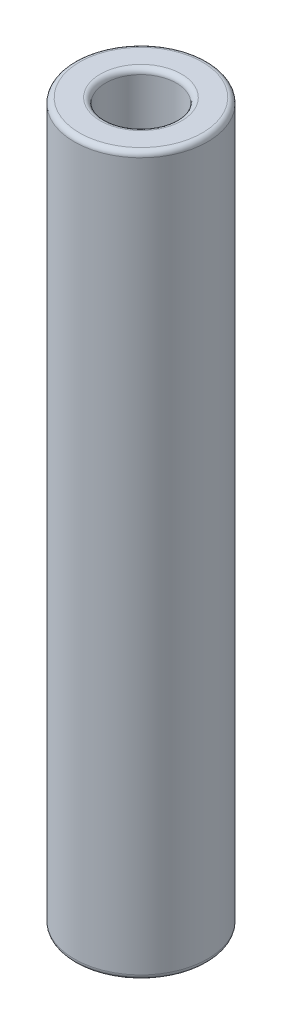
ISO-10303-21;
HEADER;
FILE_DESCRIPTION(('STEP AP214'),'2;1');
FILE_NAME('part.step','',(''),(''),'','','');
FILE_SCHEMA(('AUTOMOTIVE_DESIGN { 1 0 10303 214 1 1 1 1 }'));
ENDSEC;
DATA;
#1=APPLICATION_CONTEXT('core data for automotive mechanical design processes');
#2=APPLICATION_PROTOCOL_DEFINITION('international standard','automotive_design',2000,#1);
#3=PRODUCT_CONTEXT('',#1,'mechanical');
#4=PRODUCT('Part','Part','',(#3));
#5=PRODUCT_RELATED_PRODUCT_CATEGORY('part','',(#4));
#6=PRODUCT_DEFINITION_FORMATION('','',#4);
#7=PRODUCT_DEFINITION_CONTEXT('part definition',#1,'design');
#8=PRODUCT_DEFINITION('design','',#6,#7);
#9=PRODUCT_DEFINITION_SHAPE('','',#8);
#10=(LENGTH_UNIT() NAMED_UNIT(*) SI_UNIT(.MILLI.,.METRE.));
#11=(NAMED_UNIT(*) PLANE_ANGLE_UNIT() SI_UNIT($,.RADIAN.));
#12=(NAMED_UNIT(*) SI_UNIT($,.STERADIAN.) SOLID_ANGLE_UNIT());
#13=UNCERTAINTY_MEASURE_WITH_UNIT(LENGTH_MEASURE(1.E-05),#10,'distance_accuracy_value','');
#14=(GEOMETRIC_REPRESENTATION_CONTEXT(3) GLOBAL_UNCERTAINTY_ASSIGNED_CONTEXT((#13)) GLOBAL_UNIT_ASSIGNED_CONTEXT((#10,
#11,#12)) REPRESENTATION_CONTEXT('',''));
#15=CARTESIAN_POINT('',(0.,0.,0.));
#16=DIRECTION('',(0.,0.,1.));
#17=DIRECTION('',(1.,0.,0.));
#18=AXIS2_PLACEMENT_3D('',#15,#16,#17);
#19=CARTESIAN_POINT('',(0.,34.5,0.));
#20=DIRECTION('',(0.,1.,0.));
#21=DIRECTION('',(0.,0.,1.));
#22=AXIS2_PLACEMENT_3D('',#19,#20,#21);
#23=PLANE('',#22);
#24=CARTESIAN_POINT('',(0.,34.5,0.));
#25=DIRECTION('',(0.,1.,0.));
#26=DIRECTION('',(0.,0.,1.));
#27=AXIS2_PLACEMENT_3D('',#24,#25,#26);
#28=CIRCLE('',#27,1.95);
#29=CARTESIAN_POINT('',(0.,34.5,1.95));
#30=VERTEX_POINT('',#29);
#31=EDGE_CURVE('E10',#30,#30,#28,.F.);
#32=ORIENTED_EDGE('',*,*,#31,.T.);
#33=EDGE_LOOP('',(#32));
#34=FACE_BOUND('',#33,.T.);
#35=CARTESIAN_POINT('',(0.,34.5,0.));
#36=DIRECTION('',(0.,1.,0.));
#37=DIRECTION('',(0.,0.,1.));
#38=AXIS2_PLACEMENT_3D('',#35,#36,#37);
#39=CIRCLE('',#38,2.95);
#40=CARTESIAN_POINT('',(0.,34.5,2.95));
#41=VERTEX_POINT('',#40);
#42=EDGE_CURVE('E45',#41,#41,#39,.T.);
#43=ORIENTED_EDGE('',*,*,#42,.T.);
#44=EDGE_LOOP('',(#43));
#45=FACE_BOUND('',#44,.T.);
#46=ADVANCED_FACE('F37',(#34,#45),#23,.T.);
#47=CARTESIAN_POINT('',(0.,0.,0.));
#48=DIRECTION('',(0.,1.,0.));
#49=DIRECTION('',(0.,0.,1.));
#50=AXIS2_PLACEMENT_3D('',#47,#48,#49);
#51=PLANE('',#50);
#52=CARTESIAN_POINT('',(0.,0.,0.));
#53=DIRECTION('',(0.,1.,0.));
#54=DIRECTION('',(0.,0.,1.));
#55=AXIS2_PLACEMENT_3D('',#52,#53,#54);
#56=CIRCLE('',#55,1.95);
#57=CARTESIAN_POINT('',(0.,0.,1.95));
#58=VERTEX_POINT('',#57);
#59=EDGE_CURVE('E69',#58,#58,#56,.T.);
#60=ORIENTED_EDGE('',*,*,#59,.T.);
#61=EDGE_LOOP('',(#60));
#62=FACE_BOUND('',#61,.T.);
#63=CARTESIAN_POINT('',(0.,0.,0.));
#64=DIRECTION('',(0.,1.,0.));
#65=DIRECTION('',(0.,0.,1.));
#66=AXIS2_PLACEMENT_3D('',#63,#64,#65);
#67=CIRCLE('',#66,2.95);
#68=CARTESIAN_POINT('',(0.,0.,2.95));
#69=VERTEX_POINT('',#68);
#70=EDGE_CURVE('E73',#69,#69,#67,.F.);
#71=ORIENTED_EDGE('',*,*,#70,.T.);
#72=EDGE_LOOP('',(#71));
#73=FACE_BOUND('',#72,.T.);
#74=ADVANCED_FACE('F78',(#62,#73),#51,.F.);
#75=CARTESIAN_POINT('',(0.,34.5,0.));
#76=DIRECTION('',(0.,-1.,0.));
#77=DIRECTION('',(0.,0.,-1.));
#78=AXIS2_PLACEMENT_3D('',#75,#76,#77);
#79=CYLINDRICAL_SURFACE('',#78,3.2);
#80=CARTESIAN_POINT('',(0.,0.25,0.));
#81=DIRECTION('',(0.,1.,0.));
#82=DIRECTION('',(0.,0.,1.));
#83=AXIS2_PLACEMENT_3D('',#80,#81,#82);
#84=CIRCLE('',#83,3.2);
#85=CARTESIAN_POINT('',(0.,0.25,3.2));
#86=VERTEX_POINT('',#85);
#87=EDGE_CURVE('E50',#86,#86,#84,.T.);
#88=ORIENTED_EDGE('',*,*,#87,.T.);
#89=EDGE_LOOP('',(#88));
#90=FACE_BOUND('',#89,.T.);
#91=CARTESIAN_POINT('',(0.,34.25,0.));
#92=DIRECTION('',(0.,1.,0.));
#93=DIRECTION('',(0.,0.,1.));
#94=AXIS2_PLACEMENT_3D('',#91,#92,#93);
#95=CIRCLE('',#94,3.2);
#96=CARTESIAN_POINT('',(0.,34.25,3.2));
#97=VERTEX_POINT('',#96);
#98=EDGE_CURVE('E55',#97,#97,#95,.F.);
#99=ORIENTED_EDGE('',*,*,#98,.T.);
#100=EDGE_LOOP('',(#99));
#101=FACE_BOUND('',#100,.T.);
#102=ADVANCED_FACE('F88',(#90,#101),#79,.T.);
#103=CARTESIAN_POINT('',(0.,34.5,0.));
#104=DIRECTION('',(0.,-1.,0.));
#105=DIRECTION('',(0.,0.,-1.));
#106=AXIS2_PLACEMENT_3D('',#103,#104,#105);
#107=CYLINDRICAL_SURFACE('',#106,1.7);
#108=CARTESIAN_POINT('',(0.,0.25,0.));
#109=DIRECTION('',(0.,1.,0.));
#110=DIRECTION('',(0.,0.,1.));
#111=AXIS2_PLACEMENT_3D('',#108,#109,#110);
#112=CIRCLE('',#111,1.7);
#113=CARTESIAN_POINT('',(0.,0.25,1.7));
#114=VERTEX_POINT('',#113);
#115=EDGE_CURVE('E61',#114,#114,#112,.F.);
#116=ORIENTED_EDGE('',*,*,#115,.T.);
#117=EDGE_LOOP('',(#116));
#118=FACE_BOUND('',#117,.T.);
#119=CARTESIAN_POINT('',(0.,34.25,0.));
#120=DIRECTION('',(0.,1.,0.));
#121=DIRECTION('',(0.,0.,1.));
#122=AXIS2_PLACEMENT_3D('',#119,#120,#121);
#123=CIRCLE('',#122,1.7);
#124=CARTESIAN_POINT('',(0.,34.25,1.7));
#125=VERTEX_POINT('',#124);
#126=EDGE_CURVE('E65',#125,#125,#123,.T.);
#127=ORIENTED_EDGE('',*,*,#126,.T.);
#128=EDGE_LOOP('',(#127));
#129=FACE_BOUND('',#128,.T.);
#130=ADVANCED_FACE('F91',(#118,#129),#107,.F.);
#131=CARTESIAN_POINT('',(0.,0.25,0.));
#132=DIRECTION('',(0.,1.,0.));
#133=DIRECTION('',(0.,0.,1.));
#134=AXIS2_PLACEMENT_3D('',#131,#132,#133);
#135=TOROIDAL_SURFACE('',#134,1.95,0.25);
#136=ORIENTED_EDGE('',*,*,#115,.F.);
#137=EDGE_LOOP('',(#136));
#138=FACE_BOUND('',#137,.T.);
#139=ORIENTED_EDGE('',*,*,#59,.F.);
#140=EDGE_LOOP('',(#139));
#141=FACE_BOUND('',#140,.T.);
#142=ADVANCED_FACE('F84',(#138,#141),#135,.T.);
#143=CARTESIAN_POINT('',(0.,0.25,0.));
#144=DIRECTION('',(0.,1.,0.));
#145=DIRECTION('',(0.,0.,1.));
#146=AXIS2_PLACEMENT_3D('',#143,#144,#145);
#147=TOROIDAL_SURFACE('',#146,2.95,0.25);
#148=ORIENTED_EDGE('',*,*,#70,.F.);
#149=EDGE_LOOP('',(#148));
#150=FACE_BOUND('',#149,.T.);
#151=ORIENTED_EDGE('',*,*,#87,.F.);
#152=EDGE_LOOP('',(#151));
#153=FACE_BOUND('',#152,.T.);
#154=ADVANCED_FACE('F80',(#150,#153),#147,.T.);
#155=CARTESIAN_POINT('',(0.,34.25,0.));
#156=DIRECTION('',(0.,1.,0.));
#157=DIRECTION('',(0.,0.,1.));
#158=AXIS2_PLACEMENT_3D('',#155,#156,#157);
#159=TOROIDAL_SURFACE('',#158,1.95,0.25);
#160=ORIENTED_EDGE('',*,*,#31,.F.);
#161=EDGE_LOOP('',(#160));
#162=FACE_BOUND('',#161,.T.);
#163=ORIENTED_EDGE('',*,*,#126,.F.);
#164=EDGE_LOOP('',(#163));
#165=FACE_BOUND('',#164,.T.);
#166=ADVANCED_FACE('F83',(#162,#165),#159,.T.);
#167=CARTESIAN_POINT('',(0.,34.25,0.));
#168=DIRECTION('',(0.,1.,0.));
#169=DIRECTION('',(0.,0.,1.));
#170=AXIS2_PLACEMENT_3D('',#167,#168,#169);
#171=TOROIDAL_SURFACE('',#170,2.95,0.25);
#172=ORIENTED_EDGE('',*,*,#98,.F.);
#173=EDGE_LOOP('',(#172));
#174=FACE_BOUND('',#173,.T.);
#175=ORIENTED_EDGE('',*,*,#42,.F.);
#176=EDGE_LOOP('',(#175));
#177=FACE_BOUND('',#176,.T.);
#178=ADVANCED_FACE('F39',(#174,#177),#171,.T.);
#179=CLOSED_SHELL('',(#46,#74,#102,#130,#142,#154,#166,#178));
#180=MANIFOLD_SOLID_BREP('B2',#179);
#181=ADVANCED_BREP_SHAPE_REPRESENTATION('',(#18,#180),#14);
#182=SHAPE_DEFINITION_REPRESENTATION(#9,#181);
ENDSEC;
END-ISO-10303-21;
